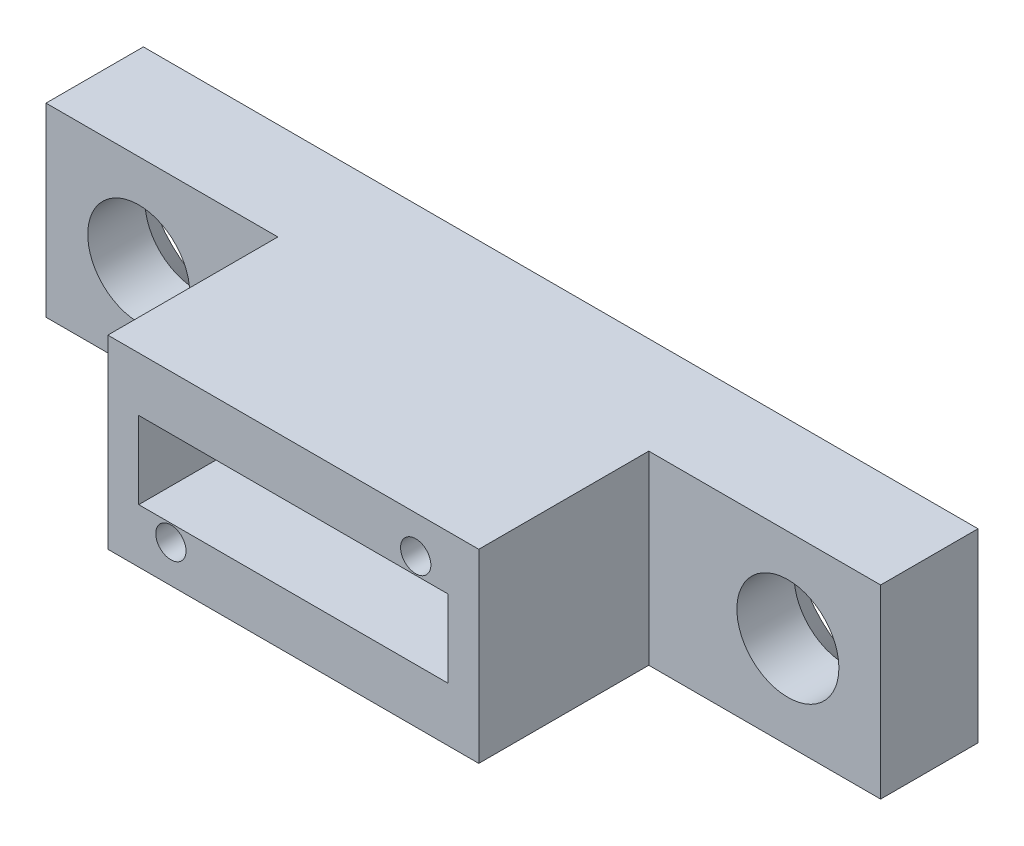
ISO-10303-21;
HEADER;
FILE_DESCRIPTION(('STEP AP214'),'2;1');
FILE_NAME('part.step','',(''),(''),'','','');
FILE_SCHEMA(('AUTOMOTIVE_DESIGN { 1 0 10303 214 1 1 1 1 }'));
ENDSEC;
DATA;
#1=APPLICATION_CONTEXT('core data for automotive mechanical design processes');
#2=APPLICATION_PROTOCOL_DEFINITION('international standard','automotive_design',2000,#1);
#3=PRODUCT_CONTEXT('',#1,'mechanical');
#4=PRODUCT('Part','Part','',(#3));
#5=PRODUCT_RELATED_PRODUCT_CATEGORY('part','',(#4));
#6=PRODUCT_DEFINITION_FORMATION('','',#4);
#7=PRODUCT_DEFINITION_CONTEXT('part definition',#1,'design');
#8=PRODUCT_DEFINITION('design','',#6,#7);
#9=PRODUCT_DEFINITION_SHAPE('','',#8);
#10=(LENGTH_UNIT() NAMED_UNIT(*) SI_UNIT(.MILLI.,.METRE.));
#11=(NAMED_UNIT(*) PLANE_ANGLE_UNIT() SI_UNIT($,.RADIAN.));
#12=(NAMED_UNIT(*) SI_UNIT($,.STERADIAN.) SOLID_ANGLE_UNIT());
#13=UNCERTAINTY_MEASURE_WITH_UNIT(LENGTH_MEASURE(1.E-05),#10,'distance_accuracy_value','');
#14=(GEOMETRIC_REPRESENTATION_CONTEXT(3) GLOBAL_UNCERTAINTY_ASSIGNED_CONTEXT((#13)) GLOBAL_UNIT_ASSIGNED_CONTEXT((#10,
#11,#12)) REPRESENTATION_CONTEXT('',''));
#15=CARTESIAN_POINT('',(0.,0.,0.));
#16=DIRECTION('',(0.,0.,1.));
#17=DIRECTION('',(1.,0.,0.));
#18=AXIS2_PLACEMENT_3D('',#15,#16,#17);
#19=CARTESIAN_POINT('',(0.,0.,3.15));
#20=DIRECTION('',(0.,0.,1.));
#21=DIRECTION('',(1.,0.,0.));
#22=AXIS2_PLACEMENT_3D('',#19,#20,#21);
#23=PLANE('',#22);
#24=DIRECTION('',(0.,1.,0.));
#25=VECTOR('',#24,1.);
#26=CARTESIAN_POINT('',(-7.5,0.,3.15));
#27=LINE('',#26,#25);
#28=CARTESIAN_POINT('',(-7.5,0.,3.15));
#29=VERTEX_POINT('',#28);
#30=CARTESIAN_POINT('',(-7.5,6.,3.15));
#31=VERTEX_POINT('',#30);
#32=EDGE_CURVE('E192',#29,#31,#27,.T.);
#33=ORIENTED_EDGE('',*,*,#32,.F.);
#34=DIRECTION('',(1.,0.,0.));
#35=VECTOR('',#34,1.);
#36=CARTESIAN_POINT('',(0.,0.,3.15));
#37=LINE('',#36,#35);
#38=CARTESIAN_POINT('',(0.,0.,3.15));
#39=VERTEX_POINT('',#38);
#40=EDGE_CURVE('E250',#29,#39,#37,.T.);
#41=ORIENTED_EDGE('',*,*,#40,.T.);
#42=DIRECTION('',(0.,1.,0.));
#43=VECTOR('',#42,1.);
#44=CARTESIAN_POINT('',(0.,0.,3.15));
#45=LINE('',#44,#43);
#46=CARTESIAN_POINT('',(0.,6.,3.15));
#47=VERTEX_POINT('',#46);
#48=EDGE_CURVE('E238',#39,#47,#45,.T.);
#49=ORIENTED_EDGE('',*,*,#48,.T.);
#50=DIRECTION('',(-1.,0.,0.));
#51=VECTOR('',#50,1.);
#52=CARTESIAN_POINT('',(0.,6.,3.15));
#53=LINE('',#52,#51);
#54=EDGE_CURVE('E244',#47,#31,#53,.T.);
#55=ORIENTED_EDGE('',*,*,#54,.T.);
#56=EDGE_LOOP('',(#33,#41,#49,#55));
#57=FACE_BOUND('',#56,.T.);
#58=CARTESIAN_POINT('',(-3.,3.,3.15));
#59=DIRECTION('',(0.,0.,1.));
#60=DIRECTION('',(1.,0.,0.));
#61=AXIS2_PLACEMENT_3D('',#58,#59,#60);
#62=CIRCLE('',#61,1.65);
#63=CARTESIAN_POINT('',(-1.35,3.,3.15));
#64=VERTEX_POINT('',#63);
#65=EDGE_CURVE('E233',#64,#64,#62,.T.);
#66=ORIENTED_EDGE('',*,*,#65,.F.);
#67=EDGE_LOOP('',(#66));
#68=FACE_BOUND('',#67,.T.);
#69=ADVANCED_FACE('F53',(#57,#68),#23,.T.);
#70=DIRECTION('',(0.,-1.,0.));
#71=VECTOR('',#70,1.);
#72=CARTESIAN_POINT('',(-19.5,0.,3.15));
#73=LINE('',#72,#71);
#74=CARTESIAN_POINT('',(-19.5,6.,3.15));
#75=VERTEX_POINT('',#74);
#76=CARTESIAN_POINT('',(-19.5,0.,3.15));
#77=VERTEX_POINT('',#76);
#78=EDGE_CURVE('E198',#75,#77,#73,.T.);
#79=ORIENTED_EDGE('',*,*,#78,.F.);
#80=CARTESIAN_POINT('',(-27.,6.,3.15));
#81=VERTEX_POINT('',#80);
#82=EDGE_CURVE('E242',#75,#81,#53,.T.);
#83=ORIENTED_EDGE('',*,*,#82,.T.);
#84=DIRECTION('',(0.,-1.,0.));
#85=VECTOR('',#84,1.);
#86=CARTESIAN_POINT('',(-27.,0.,3.15));
#87=LINE('',#86,#85);
#88=CARTESIAN_POINT('',(-27.,0.,3.15));
#89=VERTEX_POINT('',#88);
#90=EDGE_CURVE('E247',#81,#89,#87,.T.);
#91=ORIENTED_EDGE('',*,*,#90,.T.);
#92=EDGE_CURVE('E251',#89,#77,#37,.T.);
#93=ORIENTED_EDGE('',*,*,#92,.T.);
#94=EDGE_LOOP('',(#79,#83,#91,#93));
#95=FACE_BOUND('',#94,.T.);
#96=CARTESIAN_POINT('',(-24.,3.,3.15));
#97=DIRECTION('',(0.,0.,1.));
#98=DIRECTION('',(1.,0.,0.));
#99=AXIS2_PLACEMENT_3D('',#96,#97,#98);
#100=CIRCLE('',#99,1.65);
#101=CARTESIAN_POINT('',(-22.35,3.,3.15));
#102=VERTEX_POINT('',#101);
#103=EDGE_CURVE('E229',#102,#102,#100,.T.);
#104=ORIENTED_EDGE('',*,*,#103,.F.);
#105=EDGE_LOOP('',(#104));
#106=FACE_BOUND('',#105,.T.);
#107=ADVANCED_FACE('F305',(#95,#106),#23,.T.);
#108=CARTESIAN_POINT('',(0.,0.,0.));
#109=DIRECTION('',(0.,0.,1.));
#110=DIRECTION('',(1.,0.,0.));
#111=AXIS2_PLACEMENT_3D('',#108,#109,#110);
#112=PLANE('',#111);
#113=CARTESIAN_POINT('',(-24.,3.,0.));
#114=DIRECTION('',(0.,0.,1.));
#115=DIRECTION('',(1.,0.,0.));
#116=AXIS2_PLACEMENT_3D('',#113,#114,#115);
#117=CIRCLE('',#116,2.94999999999999);
#118=CARTESIAN_POINT('',(-21.05,3.,0.));
#119=VERTEX_POINT('',#118);
#120=EDGE_CURVE('E285',#119,#119,#117,.T.);
#121=ORIENTED_EDGE('',*,*,#120,.T.);
#122=EDGE_LOOP('',(#121));
#123=FACE_BOUND('',#122,.T.);
#124=CARTESIAN_POINT('',(-3.,3.,0.));
#125=DIRECTION('',(0.,0.,1.));
#126=DIRECTION('',(1.,0.,0.));
#127=AXIS2_PLACEMENT_3D('',#124,#125,#126);
#128=CIRCLE('',#127,2.95);
#129=CARTESIAN_POINT('',(-0.0500000000000023,3.,0.));
#130=VERTEX_POINT('',#129);
#131=EDGE_CURVE('E281',#130,#130,#128,.T.);
#132=ORIENTED_EDGE('',*,*,#131,.T.);
#133=EDGE_LOOP('',(#132));
#134=FACE_BOUND('',#133,.T.);
#135=DIRECTION('',(-1.,0.,0.));
#136=VECTOR('',#135,1.);
#137=CARTESIAN_POINT('',(0.,4.25,0.));
#138=LINE('',#137,#136);
#139=CARTESIAN_POINT('',(-8.5,4.25,0.));
#140=VERTEX_POINT('',#139);
#141=CARTESIAN_POINT('',(-18.5,4.25,0.));
#142=VERTEX_POINT('',#141);
#143=EDGE_CURVE('E184',#140,#142,#138,.T.);
#144=ORIENTED_EDGE('',*,*,#143,.T.);
#145=DIRECTION('',(0.,-1.,0.));
#146=VECTOR('',#145,1.);
#147=CARTESIAN_POINT('',(-18.5,0.,0.));
#148=LINE('',#147,#146);
#149=CARTESIAN_POINT('',(-18.5,1.75,0.));
#150=VERTEX_POINT('',#149);
#151=EDGE_CURVE('E188',#142,#150,#148,.T.);
#152=ORIENTED_EDGE('',*,*,#151,.T.);
#153=DIRECTION('',(1.,0.,0.));
#154=VECTOR('',#153,1.);
#155=CARTESIAN_POINT('',(0.,1.75,0.));
#156=LINE('',#155,#154);
#157=CARTESIAN_POINT('',(-8.5,1.75,0.));
#158=VERTEX_POINT('',#157);
#159=EDGE_CURVE('E175',#150,#158,#156,.T.);
#160=ORIENTED_EDGE('',*,*,#159,.T.);
#161=DIRECTION('',(0.,1.,0.));
#162=VECTOR('',#161,1.);
#163=CARTESIAN_POINT('',(-8.5,0.,0.));
#164=LINE('',#163,#162);
#165=EDGE_CURVE('E150',#158,#140,#164,.T.);
#166=ORIENTED_EDGE('',*,*,#165,.T.);
#167=EDGE_LOOP('',(#144,#152,#160,#166));
#168=FACE_BOUND('',#167,.T.);
#169=DIRECTION('',(0.,1.,0.));
#170=VECTOR('',#169,1.);
#171=CARTESIAN_POINT('',(0.,0.,0.));
#172=LINE('',#171,#170);
#173=CARTESIAN_POINT('',(0.,0.,0.));
#174=VERTEX_POINT('',#173);
#175=CARTESIAN_POINT('',(0.,6.,0.));
#176=VERTEX_POINT('',#175);
#177=EDGE_CURVE('E237',#174,#176,#172,.T.);
#178=ORIENTED_EDGE('',*,*,#177,.F.);
#179=DIRECTION('',(1.,0.,0.));
#180=VECTOR('',#179,1.);
#181=CARTESIAN_POINT('',(0.,0.,0.));
#182=LINE('',#181,#180);
#183=CARTESIAN_POINT('',(-27.,0.,0.));
#184=VERTEX_POINT('',#183);
#185=EDGE_CURVE('E243',#184,#174,#182,.T.);
#186=ORIENTED_EDGE('',*,*,#185,.F.);
#187=DIRECTION('',(0.,-1.,0.));
#188=VECTOR('',#187,1.);
#189=CARTESIAN_POINT('',(-27.,0.,0.));
#190=LINE('',#189,#188);
#191=CARTESIAN_POINT('',(-27.,6.,0.));
#192=VERTEX_POINT('',#191);
#193=EDGE_CURVE('E261',#192,#184,#190,.T.);
#194=ORIENTED_EDGE('',*,*,#193,.F.);
#195=DIRECTION('',(-1.,0.,0.));
#196=VECTOR('',#195,1.);
#197=CARTESIAN_POINT('',(0.,6.,0.));
#198=LINE('',#197,#196);
#199=EDGE_CURVE('E258',#176,#192,#198,.T.);
#200=ORIENTED_EDGE('',*,*,#199,.F.);
#201=EDGE_LOOP('',(#178,#186,#194,#200));
#202=FACE_BOUND('',#201,.T.);
#203=ADVANCED_FACE('F301',(#123,#134,#168,#202),#112,.F.);
#204=CARTESIAN_POINT('',(0.,0.,3.15));
#205=DIRECTION('',(-1.,0.,0.));
#206=DIRECTION('',(0.,0.,1.));
#207=AXIS2_PLACEMENT_3D('',#204,#205,#206);
#208=PLANE('',#207);
#209=ORIENTED_EDGE('',*,*,#177,.T.);
#210=DIRECTION('',(0.,0.,-1.));
#211=VECTOR('',#210,1.);
#212=CARTESIAN_POINT('',(0.,6.,3.15));
#213=LINE('',#212,#211);
#214=EDGE_CURVE('E277',#47,#176,#213,.T.);
#215=ORIENTED_EDGE('',*,*,#214,.F.);
#216=ORIENTED_EDGE('',*,*,#48,.F.);
#217=DIRECTION('',(0.,0.,-1.));
#218=VECTOR('',#217,1.);
#219=CARTESIAN_POINT('',(0.,0.,3.15));
#220=LINE('',#219,#218);
#221=EDGE_CURVE('E254',#39,#174,#220,.T.);
#222=ORIENTED_EDGE('',*,*,#221,.T.);
#223=EDGE_LOOP('',(#209,#215,#216,#222));
#224=FACE_BOUND('',#223,.T.);
#225=ADVANCED_FACE('F304',(#224),#208,.F.);
#226=CARTESIAN_POINT('',(0.,6.,3.15));
#227=DIRECTION('',(0.,-1.,0.));
#228=DIRECTION('',(0.,0.,-1.));
#229=AXIS2_PLACEMENT_3D('',#226,#227,#228);
#230=PLANE('',#229);
#231=ORIENTED_EDGE('',*,*,#199,.T.);
#232=DIRECTION('',(0.,0.,-1.));
#233=VECTOR('',#232,1.);
#234=CARTESIAN_POINT('',(-27.,6.,3.15));
#235=LINE('',#234,#233);
#236=EDGE_CURVE('E273',#81,#192,#235,.T.);
#237=ORIENTED_EDGE('',*,*,#236,.F.);
#238=ORIENTED_EDGE('',*,*,#82,.F.);
#239=DIRECTION('',(0.,0.,-1.));
#240=VECTOR('',#239,1.);
#241=CARTESIAN_POINT('',(-19.5,6.,8.65));
#242=LINE('',#241,#240);
#243=CARTESIAN_POINT('',(-19.5,6.,8.65));
#244=VERTEX_POINT('',#243);
#245=EDGE_CURVE('E221',#244,#75,#242,.T.);
#246=ORIENTED_EDGE('',*,*,#245,.F.);
#247=DIRECTION('',(-1.,0.,0.));
#248=VECTOR('',#247,1.);
#249=CARTESIAN_POINT('',(-19.5,6.,8.65));
#250=LINE('',#249,#248);
#251=CARTESIAN_POINT('',(-7.5,6.,8.65));
#252=VERTEX_POINT('',#251);
#253=EDGE_CURVE('E197',#252,#244,#250,.T.);
#254=ORIENTED_EDGE('',*,*,#253,.F.);
#255=DIRECTION('',(0.,0.,-1.));
#256=VECTOR('',#255,1.);
#257=CARTESIAN_POINT('',(-7.5,6.,8.65));
#258=LINE('',#257,#256);
#259=EDGE_CURVE('E225',#252,#31,#258,.T.);
#260=ORIENTED_EDGE('',*,*,#259,.T.);
#261=ORIENTED_EDGE('',*,*,#54,.F.);
#262=ORIENTED_EDGE('',*,*,#214,.T.);
#263=EDGE_LOOP('',(#231,#237,#238,#246,#254,#260,#261,#262));
#264=FACE_BOUND('',#263,.T.);
#265=ADVANCED_FACE('F329',(#264),#230,.F.);
#266=CARTESIAN_POINT('',(-27.,0.,3.15));
#267=DIRECTION('',(1.,0.,0.));
#268=DIRECTION('',(0.,0.,-1.));
#269=AXIS2_PLACEMENT_3D('',#266,#267,#268);
#270=PLANE('',#269);
#271=ORIENTED_EDGE('',*,*,#193,.T.);
#272=DIRECTION('',(0.,0.,-1.));
#273=VECTOR('',#272,1.);
#274=CARTESIAN_POINT('',(-27.,0.,3.15));
#275=LINE('',#274,#273);
#276=EDGE_CURVE('E269',#89,#184,#275,.T.);
#277=ORIENTED_EDGE('',*,*,#276,.F.);
#278=ORIENTED_EDGE('',*,*,#90,.F.);
#279=ORIENTED_EDGE('',*,*,#236,.T.);
#280=EDGE_LOOP('',(#271,#277,#278,#279));
#281=FACE_BOUND('',#280,.T.);
#282=ADVANCED_FACE('F325',(#281),#270,.F.);
#283=CARTESIAN_POINT('',(0.,0.,3.15));
#284=DIRECTION('',(0.,1.,0.));
#285=DIRECTION('',(-1.,0.,0.));
#286=AXIS2_PLACEMENT_3D('',#283,#284,#285);
#287=PLANE('',#286);
#288=ORIENTED_EDGE('',*,*,#185,.T.);
#289=ORIENTED_EDGE('',*,*,#221,.F.);
#290=ORIENTED_EDGE('',*,*,#40,.F.);
#291=DIRECTION('',(0.,0.,-1.));
#292=VECTOR('',#291,1.);
#293=CARTESIAN_POINT('',(-7.5,0.,8.65));
#294=LINE('',#293,#292);
#295=CARTESIAN_POINT('',(-7.5,0.,8.65));
#296=VERTEX_POINT('',#295);
#297=EDGE_CURVE('E207',#296,#29,#294,.T.);
#298=ORIENTED_EDGE('',*,*,#297,.F.);
#299=DIRECTION('',(1.,0.,0.));
#300=VECTOR('',#299,1.);
#301=CARTESIAN_POINT('',(-19.5,0.,8.65));
#302=LINE('',#301,#300);
#303=CARTESIAN_POINT('',(-19.5,0.,8.65));
#304=VERTEX_POINT('',#303);
#305=EDGE_CURVE('E204',#304,#296,#302,.T.);
#306=ORIENTED_EDGE('',*,*,#305,.F.);
#307=DIRECTION('',(0.,0.,-1.));
#308=VECTOR('',#307,1.);
#309=CARTESIAN_POINT('',(-19.5,0.,8.65));
#310=LINE('',#309,#308);
#311=EDGE_CURVE('E217',#304,#77,#310,.T.);
#312=ORIENTED_EDGE('',*,*,#311,.T.);
#313=ORIENTED_EDGE('',*,*,#92,.F.);
#314=ORIENTED_EDGE('',*,*,#276,.T.);
#315=EDGE_LOOP('',(#288,#289,#290,#298,#306,#312,#313,#314));
#316=FACE_BOUND('',#315,.T.);
#317=ADVANCED_FACE('F319',(#316),#287,.F.);
#318=CARTESIAN_POINT('',(-3.,3.,3.15));
#319=DIRECTION('',(0.,0.,-1.));
#320=DIRECTION('',(-1.,0.,0.));
#321=AXIS2_PLACEMENT_3D('',#318,#319,#320);
#322=CYLINDRICAL_SURFACE('',#321,1.65);
#323=CARTESIAN_POINT('',(-3.,3.,1.3));
#324=DIRECTION('',(0.,0.,1.));
#325=DIRECTION('',(1.,0.,0.));
#326=AXIS2_PLACEMENT_3D('',#323,#324,#325);
#327=CIRCLE('',#326,1.65);
#328=CARTESIAN_POINT('',(-1.35,3.,1.3));
#329=VERTEX_POINT('',#328);
#330=EDGE_CURVE('E11',#329,#329,#327,.F.);
#331=ORIENTED_EDGE('',*,*,#330,.T.);
#332=EDGE_LOOP('',(#331));
#333=FACE_BOUND('',#332,.T.);
#334=ORIENTED_EDGE('',*,*,#65,.T.);
#335=EDGE_LOOP('',(#334));
#336=FACE_BOUND('',#335,.T.);
#337=ADVANCED_FACE('F353',(#333,#336),#322,.F.);
#338=CARTESIAN_POINT('',(-24.,3.,3.15));
#339=DIRECTION('',(0.,0.,-1.));
#340=DIRECTION('',(-1.,0.,0.));
#341=AXIS2_PLACEMENT_3D('',#338,#339,#340);
#342=CYLINDRICAL_SURFACE('',#341,1.65);
#343=CARTESIAN_POINT('',(-24.,3.,1.3));
#344=DIRECTION('',(0.,0.,1.));
#345=DIRECTION('',(1.,0.,0.));
#346=AXIS2_PLACEMENT_3D('',#343,#344,#345);
#347=CIRCLE('',#346,1.65);
#348=CARTESIAN_POINT('',(-22.35,3.,1.3));
#349=VERTEX_POINT('',#348);
#350=EDGE_CURVE('E63',#349,#349,#347,.F.);
#351=ORIENTED_EDGE('',*,*,#350,.T.);
#352=EDGE_LOOP('',(#351));
#353=FACE_BOUND('',#352,.T.);
#354=ORIENTED_EDGE('',*,*,#103,.T.);
#355=EDGE_LOOP('',(#354));
#356=FACE_BOUND('',#355,.T.);
#357=ADVANCED_FACE('F292',(#353,#356),#342,.F.);
#358=CARTESIAN_POINT('',(-7.5,0.,8.65));
#359=DIRECTION('',(-1.,0.,0.));
#360=DIRECTION('',(0.,0.,1.));
#361=AXIS2_PLACEMENT_3D('',#358,#359,#360);
#362=PLANE('',#361);
#363=ORIENTED_EDGE('',*,*,#32,.T.);
#364=ORIENTED_EDGE('',*,*,#259,.F.);
#365=DIRECTION('',(0.,1.,0.));
#366=VECTOR('',#365,1.);
#367=CARTESIAN_POINT('',(-7.5,0.,8.65));
#368=LINE('',#367,#366);
#369=EDGE_CURVE('E193',#296,#252,#368,.T.);
#370=ORIENTED_EDGE('',*,*,#369,.F.);
#371=ORIENTED_EDGE('',*,*,#297,.T.);
#372=EDGE_LOOP('',(#363,#364,#370,#371));
#373=FACE_BOUND('',#372,.T.);
#374=ADVANCED_FACE('F345',(#373),#362,.F.);
#375=CARTESIAN_POINT('',(-19.5,0.,8.65));
#376=DIRECTION('',(1.,0.,0.));
#377=DIRECTION('',(0.,0.,-1.));
#378=AXIS2_PLACEMENT_3D('',#375,#376,#377);
#379=PLANE('',#378);
#380=ORIENTED_EDGE('',*,*,#78,.T.);
#381=ORIENTED_EDGE('',*,*,#311,.F.);
#382=DIRECTION('',(0.,-1.,0.));
#383=VECTOR('',#382,1.);
#384=CARTESIAN_POINT('',(-19.5,0.,8.65));
#385=LINE('',#384,#383);
#386=EDGE_CURVE('E201',#244,#304,#385,.T.);
#387=ORIENTED_EDGE('',*,*,#386,.F.);
#388=ORIENTED_EDGE('',*,*,#245,.T.);
#389=EDGE_LOOP('',(#380,#381,#387,#388));
#390=FACE_BOUND('',#389,.T.);
#391=ADVANCED_FACE('F340',(#390),#379,.F.);
#392=CARTESIAN_POINT('',(0.,0.,8.65));
#393=DIRECTION('',(0.,0.,-1.));
#394=DIRECTION('',(-1.,0.,0.));
#395=AXIS2_PLACEMENT_3D('',#392,#393,#394);
#396=PLANE('',#395);
#397=CARTESIAN_POINT('',(-9.54,4.785,8.65));
#398=DIRECTION('',(0.,0.,1.));
#399=DIRECTION('',(1.,0.,0.));
#400=AXIS2_PLACEMENT_3D('',#397,#398,#399);
#401=CIRCLE('',#400,0.490000000000001);
#402=CARTESIAN_POINT('',(-9.05,4.785,8.65));
#403=VERTEX_POINT('',#402);
#404=EDGE_CURVE('E651',#403,#403,#401,.T.);
#405=ORIENTED_EDGE('',*,*,#404,.F.);
#406=EDGE_LOOP('',(#405));
#407=FACE_BOUND('',#406,.T.);
#408=CARTESIAN_POINT('',(-17.46,1.215,8.65));
#409=DIRECTION('',(0.,0.,1.));
#410=DIRECTION('',(1.,0.,0.));
#411=AXIS2_PLACEMENT_3D('',#408,#409,#410);
#412=CIRCLE('',#411,0.490000000000002);
#413=CARTESIAN_POINT('',(-16.97,1.215,8.65));
#414=VERTEX_POINT('',#413);
#415=EDGE_CURVE('E656',#414,#414,#412,.T.);
#416=ORIENTED_EDGE('',*,*,#415,.F.);
#417=EDGE_LOOP('',(#416));
#418=FACE_BOUND('',#417,.T.);
#419=DIRECTION('',(1.,0.,0.));
#420=VECTOR('',#419,1.);
#421=CARTESIAN_POINT('',(-8.5,1.75,8.65));
#422=LINE('',#421,#420);
#423=CARTESIAN_POINT('',(-18.5,1.75,8.65));
#424=VERTEX_POINT('',#423);
#425=CARTESIAN_POINT('',(-8.5,1.75,8.65));
#426=VERTEX_POINT('',#425);
#427=EDGE_CURVE('E157',#424,#426,#422,.T.);
#428=ORIENTED_EDGE('',*,*,#427,.F.);
#429=DIRECTION('',(0.,-1.,0.));
#430=VECTOR('',#429,1.);
#431=CARTESIAN_POINT('',(-18.5,1.75,8.65));
#432=LINE('',#431,#430);
#433=CARTESIAN_POINT('',(-18.5,4.25,8.65));
#434=VERTEX_POINT('',#433);
#435=EDGE_CURVE('E78',#434,#424,#432,.T.);
#436=ORIENTED_EDGE('',*,*,#435,.F.);
#437=DIRECTION('',(-1.,0.,0.));
#438=VECTOR('',#437,1.);
#439=CARTESIAN_POINT('',(-8.5,4.25,8.65));
#440=LINE('',#439,#438);
#441=CARTESIAN_POINT('',(-8.5,4.25,8.65));
#442=VERTEX_POINT('',#441);
#443=EDGE_CURVE('E165',#442,#434,#440,.T.);
#444=ORIENTED_EDGE('',*,*,#443,.F.);
#445=DIRECTION('',(0.,1.,0.));
#446=VECTOR('',#445,1.);
#447=CARTESIAN_POINT('',(-8.5,1.75,8.65));
#448=LINE('',#447,#446);
#449=EDGE_CURVE('E147',#426,#442,#448,.T.);
#450=ORIENTED_EDGE('',*,*,#449,.F.);
#451=EDGE_LOOP('',(#428,#436,#444,#450));
#452=FACE_BOUND('',#451,.T.);
#453=ORIENTED_EDGE('',*,*,#369,.T.);
#454=ORIENTED_EDGE('',*,*,#253,.T.);
#455=ORIENTED_EDGE('',*,*,#386,.T.);
#456=ORIENTED_EDGE('',*,*,#305,.T.);
#457=EDGE_LOOP('',(#453,#454,#455,#456));
#458=FACE_BOUND('',#457,.T.);
#459=ADVANCED_FACE('F162',(#407,#418,#452,#458),#396,.F.);
#460=CARTESIAN_POINT('',(-18.5,1.75,-1.35));
#461=DIRECTION('',(-1.,0.,0.));
#462=DIRECTION('',(0.,-1.,0.));
#463=AXIS2_PLACEMENT_3D('',#460,#461,#462);
#464=PLANE('',#463);
#465=DIRECTION('',(0.,0.,1.));
#466=VECTOR('',#465,1.);
#467=CARTESIAN_POINT('',(-18.5,4.25,-1.35));
#468=LINE('',#467,#466);
#469=EDGE_CURVE('E172',#142,#434,#468,.T.);
#470=ORIENTED_EDGE('',*,*,#469,.T.);
#471=ORIENTED_EDGE('',*,*,#435,.T.);
#472=DIRECTION('',(0.,0.,1.));
#473=VECTOR('',#472,1.);
#474=CARTESIAN_POINT('',(-18.5,1.75,-1.35));
#475=LINE('',#474,#473);
#476=EDGE_CURVE('E154',#150,#424,#475,.T.);
#477=ORIENTED_EDGE('',*,*,#476,.F.);
#478=ORIENTED_EDGE('',*,*,#151,.F.);
#479=EDGE_LOOP('',(#470,#471,#477,#478));
#480=FACE_BOUND('',#479,.T.);
#481=ADVANCED_FACE('F420',(#480),#464,.F.);
#482=CARTESIAN_POINT('',(-8.5,4.25,-1.35));
#483=DIRECTION('',(0.,1.,0.));
#484=DIRECTION('',(0.,0.,1.));
#485=AXIS2_PLACEMENT_3D('',#482,#483,#484);
#486=PLANE('',#485);
#487=DIRECTION('',(0.,0.,1.));
#488=VECTOR('',#487,1.);
#489=CARTESIAN_POINT('',(-8.5,4.25,-1.35));
#490=LINE('',#489,#488);
#491=EDGE_CURVE('E153',#140,#442,#490,.T.);
#492=ORIENTED_EDGE('',*,*,#491,.T.);
#493=ORIENTED_EDGE('',*,*,#443,.T.);
#494=ORIENTED_EDGE('',*,*,#469,.F.);
#495=ORIENTED_EDGE('',*,*,#143,.F.);
#496=EDGE_LOOP('',(#492,#493,#494,#495));
#497=FACE_BOUND('',#496,.T.);
#498=ADVANCED_FACE('F431',(#497),#486,.F.);
#499=CARTESIAN_POINT('',(-8.5,1.75,-1.35));
#500=DIRECTION('',(1.,0.,0.));
#501=DIRECTION('',(0.,0.,-1.));
#502=AXIS2_PLACEMENT_3D('',#499,#500,#501);
#503=PLANE('',#502);
#504=DIRECTION('',(0.,0.,1.));
#505=VECTOR('',#504,1.);
#506=CARTESIAN_POINT('',(-8.5,1.75,-1.35));
#507=LINE('',#506,#505);
#508=EDGE_CURVE('E70',#158,#426,#507,.T.);
#509=ORIENTED_EDGE('',*,*,#508,.T.);
#510=ORIENTED_EDGE('',*,*,#449,.T.);
#511=ORIENTED_EDGE('',*,*,#491,.F.);
#512=ORIENTED_EDGE('',*,*,#165,.F.);
#513=EDGE_LOOP('',(#509,#510,#511,#512));
#514=FACE_BOUND('',#513,.T.);
#515=ADVANCED_FACE('F144',(#514),#503,.F.);
#516=CARTESIAN_POINT('',(-8.5,1.75,-1.35));
#517=DIRECTION('',(0.,-1.,0.));
#518=DIRECTION('',(1.,0.,0.));
#519=AXIS2_PLACEMENT_3D('',#516,#517,#518);
#520=PLANE('',#519);
#521=ORIENTED_EDGE('',*,*,#476,.T.);
#522=ORIENTED_EDGE('',*,*,#427,.T.);
#523=ORIENTED_EDGE('',*,*,#508,.F.);
#524=ORIENTED_EDGE('',*,*,#159,.F.);
#525=EDGE_LOOP('',(#521,#522,#523,#524));
#526=FACE_BOUND('',#525,.T.);
#527=ADVANCED_FACE('F158',(#526),#520,.F.);
#528=CARTESIAN_POINT('',(-17.46,1.215,7.15));
#529=DIRECTION('',(0.,0.,1.));
#530=DIRECTION('',(1.,0.,0.));
#531=AXIS2_PLACEMENT_3D('',#528,#529,#530);
#532=CYLINDRICAL_SURFACE('',#531,0.490000000000002);
#533=CARTESIAN_POINT('',(-17.46,1.215,7.15));
#534=DIRECTION('',(0.,0.,1.));
#535=DIRECTION('',(1.,0.,0.));
#536=AXIS2_PLACEMENT_3D('',#533,#534,#535);
#537=CIRCLE('',#536,0.490000000000002);
#538=CARTESIAN_POINT('',(-16.97,1.215,7.15));
#539=VERTEX_POINT('',#538);
#540=EDGE_CURVE('E662',#539,#539,#537,.T.);
#541=ORIENTED_EDGE('',*,*,#540,.F.);
#542=EDGE_LOOP('',(#541));
#543=FACE_BOUND('',#542,.T.);
#544=ORIENTED_EDGE('',*,*,#415,.T.);
#545=EDGE_LOOP('',(#544));
#546=FACE_BOUND('',#545,.T.);
#547=ADVANCED_FACE('F457',(#543,#546),#532,.F.);
#548=CARTESIAN_POINT('',(-17.46,1.215,7.15));
#549=DIRECTION('',(0.,0.,1.));
#550=DIRECTION('',(1.,0.,0.));
#551=AXIS2_PLACEMENT_3D('',#548,#549,#550);
#552=PLANE('',#551);
#553=ORIENTED_EDGE('',*,*,#540,.T.);
#554=EDGE_LOOP('',(#553));
#555=FACE_BOUND('',#554,.T.);
#556=ADVANCED_FACE('F465',(#555),#552,.T.);
#557=CARTESIAN_POINT('',(-9.54,4.785,7.15));
#558=DIRECTION('',(0.,0.,1.));
#559=DIRECTION('',(1.,0.,0.));
#560=AXIS2_PLACEMENT_3D('',#557,#558,#559);
#561=CYLINDRICAL_SURFACE('',#560,0.490000000000001);
#562=CARTESIAN_POINT('',(-9.54,4.785,7.15));
#563=DIRECTION('',(0.,0.,1.));
#564=DIRECTION('',(1.,0.,0.));
#565=AXIS2_PLACEMENT_3D('',#562,#563,#564);
#566=CIRCLE('',#565,0.490000000000001);
#567=CARTESIAN_POINT('',(-9.05,4.785,7.15));
#568=VERTEX_POINT('',#567);
#569=EDGE_CURVE('E649',#568,#568,#566,.T.);
#570=ORIENTED_EDGE('',*,*,#569,.F.);
#571=EDGE_LOOP('',(#570));
#572=FACE_BOUND('',#571,.T.);
#573=ORIENTED_EDGE('',*,*,#404,.T.);
#574=EDGE_LOOP('',(#573));
#575=FACE_BOUND('',#574,.T.);
#576=ADVANCED_FACE('F476',(#572,#575),#561,.F.);
#577=CARTESIAN_POINT('',(-9.54,4.785,7.15));
#578=DIRECTION('',(0.,0.,1.));
#579=DIRECTION('',(1.,0.,0.));
#580=AXIS2_PLACEMENT_3D('',#577,#578,#579);
#581=PLANE('',#580);
#582=ORIENTED_EDGE('',*,*,#569,.T.);
#583=EDGE_LOOP('',(#582));
#584=FACE_BOUND('',#583,.T.);
#585=ADVANCED_FACE('F298',(#584),#581,.T.);
#586=CARTESIAN_POINT('',(-24.,3.,0.));
#587=DIRECTION('',(0.,0.,-1.));
#588=DIRECTION('',(-1.,0.,0.));
#589=AXIS2_PLACEMENT_3D('',#586,#587,#588);
#590=CONICAL_SURFACE('',#589,2.94999999999999,0.785398163397447);
#591=ORIENTED_EDGE('',*,*,#350,.F.);
#592=EDGE_LOOP('',(#591));
#593=FACE_BOUND('',#592,.T.);
#594=ORIENTED_EDGE('',*,*,#120,.F.);
#595=EDGE_LOOP('',(#594));
#596=FACE_BOUND('',#595,.T.);
#597=ADVANCED_FACE('F295',(#593,#596),#590,.F.);
#598=CARTESIAN_POINT('',(-3.,3.,0.));
#599=DIRECTION('',(0.,0.,-1.));
#600=DIRECTION('',(-1.,0.,0.));
#601=AXIS2_PLACEMENT_3D('',#598,#599,#600);
#602=CONICAL_SURFACE('',#601,2.95,0.785398163397447);
#603=ORIENTED_EDGE('',*,*,#330,.F.);
#604=EDGE_LOOP('',(#603));
#605=FACE_BOUND('',#604,.T.);
#606=ORIENTED_EDGE('',*,*,#131,.F.);
#607=EDGE_LOOP('',(#606));
#608=FACE_BOUND('',#607,.T.);
#609=ADVANCED_FACE('F56',(#605,#608),#602,.F.);
#610=CLOSED_SHELL('',(#69,#107,#203,#225,#265,#282,#317,#337,#357,#374,#391,#459,#481,#498,#515,
#527,#547,#556,#576,#585,#597,#609));
#611=MANIFOLD_SOLID_BREP('B2',#610);
#612=ADVANCED_BREP_SHAPE_REPRESENTATION('',(#18,#611),#14);
#613=SHAPE_DEFINITION_REPRESENTATION(#9,#612);
ENDSEC;
END-ISO-10303-21;
